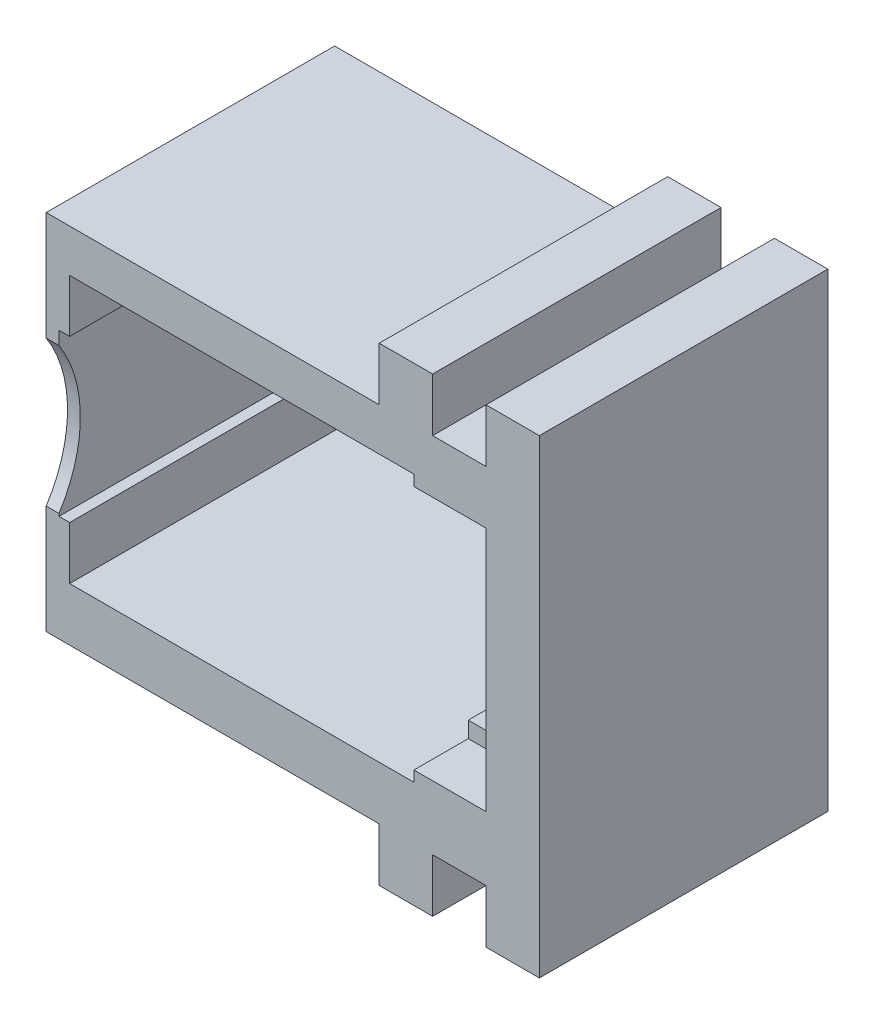
ISO-10303-21;
HEADER;
FILE_DESCRIPTION(('STEP AP214'),'2;1');
FILE_NAME('part.step','',(''),(''),'','','');
FILE_SCHEMA(('AUTOMOTIVE_DESIGN { 1 0 10303 214 1 1 1 1 }'));
ENDSEC;
DATA;
#1=APPLICATION_CONTEXT('core data for automotive mechanical design processes');
#2=APPLICATION_PROTOCOL_DEFINITION('international standard','automotive_design',2000,#1);
#3=PRODUCT_CONTEXT('',#1,'mechanical');
#4=PRODUCT('Part','Part','',(#3));
#5=PRODUCT_RELATED_PRODUCT_CATEGORY('part','',(#4));
#6=PRODUCT_DEFINITION_FORMATION('','',#4);
#7=PRODUCT_DEFINITION_CONTEXT('part definition',#1,'design');
#8=PRODUCT_DEFINITION('design','',#6,#7);
#9=PRODUCT_DEFINITION_SHAPE('','',#8);
#10=(LENGTH_UNIT() NAMED_UNIT(*) SI_UNIT(.MILLI.,.METRE.));
#11=(NAMED_UNIT(*) PLANE_ANGLE_UNIT() SI_UNIT($,.RADIAN.));
#12=(NAMED_UNIT(*) SI_UNIT($,.STERADIAN.) SOLID_ANGLE_UNIT());
#13=UNCERTAINTY_MEASURE_WITH_UNIT(LENGTH_MEASURE(1.E-05),#10,'distance_accuracy_value','');
#14=(GEOMETRIC_REPRESENTATION_CONTEXT(3) GLOBAL_UNCERTAINTY_ASSIGNED_CONTEXT((#13)) GLOBAL_UNIT_ASSIGNED_CONTEXT((#10,
#11,#12)) REPRESENTATION_CONTEXT('',''));
#15=CARTESIAN_POINT('',(0.,0.,0.));
#16=DIRECTION('',(0.,0.,1.));
#17=DIRECTION('',(1.,0.,0.));
#18=AXIS2_PLACEMENT_3D('',#15,#16,#17);
#19=CARTESIAN_POINT('',(0.,-32.0968292937225,0.));
#20=DIRECTION('',(0.,1.,0.));
#21=DIRECTION('',(0.,0.,1.));
#22=AXIS2_PLACEMENT_3D('',#19,#20,#21);
#23=PLANE('',#22);
#24=DIRECTION('',(0.,0.,-1.));
#25=VECTOR('',#24,1.);
#26=CARTESIAN_POINT('',(-28.3548906207739,-32.0968292937225,20.));
#27=LINE('',#26,#25);
#28=CARTESIAN_POINT('',(-28.3548906207739,-32.0968292937225,27.02));
#29=VERTEX_POINT('',#28);
#30=CARTESIAN_POINT('',(-28.3548906207739,-32.0968292937225,0.));
#31=VERTEX_POINT('',#30);
#32=EDGE_CURVE('E330',#29,#31,#27,.T.);
#33=ORIENTED_EDGE('',*,*,#32,.T.);
#34=DIRECTION('',(1.,0.,0.));
#35=VECTOR('',#34,1.);
#36=CARTESIAN_POINT('',(9.84510937922611,-32.0968292937225,0.));
#37=LINE('',#36,#35);
#38=CARTESIAN_POINT('',(2.84510937922611,-32.0968292937225,0.));
#39=VERTEX_POINT('',#38);
#40=EDGE_CURVE('E290',#31,#39,#37,.T.);
#41=ORIENTED_EDGE('',*,*,#40,.T.);
#42=DIRECTION('',(0.,0.,-1.));
#43=VECTOR('',#42,1.);
#44=CARTESIAN_POINT('',(2.84510937922611,-32.0968292937225,0.));
#45=LINE('',#44,#43);
#46=CARTESIAN_POINT('',(2.84510937922611,-32.0968292937225,27.02));
#47=VERTEX_POINT('',#46);
#48=EDGE_CURVE('E62',#47,#39,#45,.T.);
#49=ORIENTED_EDGE('',*,*,#48,.F.);
#50=DIRECTION('',(-1.,0.,0.));
#51=VECTOR('',#50,1.);
#52=CARTESIAN_POINT('',(-28.3548906207739,-32.0968292937225,27.02));
#53=LINE('',#52,#51);
#54=EDGE_CURVE('E327',#47,#29,#53,.T.);
#55=ORIENTED_EDGE('',*,*,#54,.T.);
#56=EDGE_LOOP('',(#33,#41,#49,#55));
#57=FACE_BOUND('',#56,.T.);
#58=ADVANCED_FACE('F45',(#57),#23,.F.);
#59=CARTESIAN_POINT('',(0.,1.90317070627753,0.));
#60=DIRECTION('',(0.,1.,0.));
#61=DIRECTION('',(0.,0.,1.));
#62=AXIS2_PLACEMENT_3D('',#59,#60,#61);
#63=PLANE('',#62);
#64=DIRECTION('',(-1.,0.,0.));
#65=VECTOR('',#64,1.);
#66=CARTESIAN_POINT('',(12.8451093792261,1.90317070627753,0.));
#67=LINE('',#66,#65);
#68=CARTESIAN_POINT('',(12.8451093792261,1.90317070627753,0.));
#69=VERTEX_POINT('',#68);
#70=CARTESIAN_POINT('',(7.8451093792261,1.90317070627753,0.));
#71=VERTEX_POINT('',#70);
#72=EDGE_CURVE('E281',#69,#71,#67,.T.);
#73=ORIENTED_EDGE('',*,*,#72,.T.);
#74=DIRECTION('',(0.,0.,1.));
#75=VECTOR('',#74,1.);
#76=CARTESIAN_POINT('',(7.8451093792261,1.90317070627753,0.));
#77=LINE('',#76,#75);
#78=CARTESIAN_POINT('',(7.84510937922608,1.90317070627753,27.02));
#79=VERTEX_POINT('',#78);
#80=EDGE_CURVE('E596',#71,#79,#77,.T.);
#81=ORIENTED_EDGE('',*,*,#80,.T.);
#82=DIRECTION('',(1.,0.,0.));
#83=VECTOR('',#82,1.);
#84=CARTESIAN_POINT('',(-28.3548906207739,1.90317070627753,27.02));
#85=LINE('',#84,#83);
#86=CARTESIAN_POINT('',(12.8451093792261,1.90317070627753,27.02));
#87=VERTEX_POINT('',#86);
#88=EDGE_CURVE('E280',#79,#87,#85,.T.);
#89=ORIENTED_EDGE('',*,*,#88,.T.);
#90=DIRECTION('',(0.,0.,-1.));
#91=VECTOR('',#90,1.);
#92=CARTESIAN_POINT('',(12.8451093792261,1.90317070627753,27.02));
#93=LINE('',#92,#91);
#94=EDGE_CURVE('E309',#87,#69,#93,.T.);
#95=ORIENTED_EDGE('',*,*,#94,.T.);
#96=EDGE_LOOP('',(#73,#81,#89,#95));
#97=FACE_BOUND('',#96,.T.);
#98=ADVANCED_FACE('F593',(#97),#63,.T.);
#99=CARTESIAN_POINT('',(-28.3548906207739,-0.0968292937224696,2.));
#100=DIRECTION('',(1.,0.,0.));
#101=DIRECTION('',(0.,0.,-1.));
#102=AXIS2_PLACEMENT_3D('',#99,#100,#101);
#103=PLANE('',#102);
#104=DIRECTION('',(0.,0.,1.));
#105=VECTOR('',#104,1.);
#106=CARTESIAN_POINT('',(-28.3548906207739,1.90317070627753,20.));
#107=LINE('',#106,#105);
#108=CARTESIAN_POINT('',(-28.3548906207739,1.90317070627753,0.));
#109=VERTEX_POINT('',#108);
#110=CARTESIAN_POINT('',(-28.3548906207739,1.90317070627753,27.02));
#111=VERTEX_POINT('',#110);
#112=EDGE_CURVE('E269',#109,#111,#107,.T.);
#113=ORIENTED_EDGE('',*,*,#112,.F.);
#114=DIRECTION('',(0.,-1.,0.));
#115=VECTOR('',#114,1.);
#116=CARTESIAN_POINT('',(-28.3548906207739,1.90317070627753,0.));
#117=LINE('',#116,#115);
#118=EDGE_CURVE('E272',#109,#31,#117,.T.);
#119=ORIENTED_EDGE('',*,*,#118,.T.);
#120=ORIENTED_EDGE('',*,*,#32,.F.);
#121=DIRECTION('',(0.,1.,0.));
#122=VECTOR('',#121,1.);
#123=CARTESIAN_POINT('',(-28.3548906207739,-0.0968292937224667,27.02));
#124=LINE('',#123,#122);
#125=CARTESIAN_POINT('',(-28.3548906207739,-21.908583840093,27.02));
#126=VERTEX_POINT('',#125);
#127=EDGE_CURVE('E390',#29,#126,#124,.T.);
#128=ORIENTED_EDGE('',*,*,#127,.T.);
#129=CARTESIAN_POINT('',(-28.3548906207739,-15.0968292937225,37.62));
#130=DIRECTION('',(-1.,0.,0.));
#131=DIRECTION('',(0.,0.,1.));
#132=AXIS2_PLACEMENT_3D('',#129,#130,#131);
#133=CIRCLE('',#132,12.6);
#134=CARTESIAN_POINT('',(-28.3548906207739,-8.2850747473519,27.02));
#135=VERTEX_POINT('',#134);
#136=EDGE_CURVE('E394',#135,#126,#133,.T.);
#137=ORIENTED_EDGE('',*,*,#136,.F.);
#138=DIRECTION('',(0.,1.,0.));
#139=VECTOR('',#138,1.);
#140=CARTESIAN_POINT('',(-28.3548906207739,-0.0968292937224667,27.02));
#141=LINE('',#140,#139);
#142=EDGE_CURVE('E275',#135,#111,#141,.T.);
#143=ORIENTED_EDGE('',*,*,#142,.T.);
#144=EDGE_LOOP('',(#113,#119,#120,#128,#137,#143));
#145=FACE_BOUND('',#144,.T.);
#146=ADVANCED_FACE('F47',(#145),#103,.F.);
#147=CARTESIAN_POINT('',(0.,0.,2.));
#148=DIRECTION('',(0.,0.,1.));
#149=DIRECTION('',(1.,0.,0.));
#150=AXIS2_PLACEMENT_3D('',#147,#148,#149);
#151=PLANE('',#150);
#152=DIRECTION('',(0.,-1.,0.));
#153=VECTOR('',#152,1.);
#154=CARTESIAN_POINT('',(-26.1548906207739,0.,2.));
#155=LINE('',#154,#153);
#156=CARTESIAN_POINT('',(-26.1548906207739,-22.1468292937225,2.));
#157=VERTEX_POINT('',#156);
#158=CARTESIAN_POINT('',(-26.1548906207739,-27.0968292937225,2.));
#159=VERTEX_POINT('',#158);
#160=EDGE_CURVE('E452',#157,#159,#155,.T.);
#161=ORIENTED_EDGE('',*,*,#160,.T.);
#162=DIRECTION('',(-1.,0.,0.));
#163=VECTOR('',#162,1.);
#164=CARTESIAN_POINT('',(-26.1548906207739,-27.0968292937225,2.));
#165=LINE('',#164,#163);
#166=CARTESIAN_POINT('',(6.09510937922611,-27.0968292937225,2.));
#167=VERTEX_POINT('',#166);
#168=EDGE_CURVE('E333',#167,#159,#165,.T.);
#169=ORIENTED_EDGE('',*,*,#168,.F.);
#170=DIRECTION('',(0.,1.,0.));
#171=VECTOR('',#170,1.);
#172=CARTESIAN_POINT('',(6.09510937922611,0.,2.));
#173=LINE('',#172,#171);
#174=CARTESIAN_POINT('',(6.09510937922611,-24.5968292937224,2.));
#175=VERTEX_POINT('',#174);
#176=EDGE_CURVE('E453',#167,#175,#173,.T.);
#177=ORIENTED_EDGE('',*,*,#176,.T.);
#178=DIRECTION('',(-1.,0.,0.));
#179=VECTOR('',#178,1.);
#180=CARTESIAN_POINT('',(0.,-24.5968292937224,2.));
#181=LINE('',#180,#179);
#182=CARTESIAN_POINT('',(7.84510937922611,-24.5968292937224,2.));
#183=VERTEX_POINT('',#182);
#184=EDGE_CURVE('E456',#183,#175,#181,.T.);
#185=ORIENTED_EDGE('',*,*,#184,.F.);
#186=DIRECTION('',(0.,1.,0.));
#187=VECTOR('',#186,1.);
#188=CARTESIAN_POINT('',(7.84510937922611,0.,2.));
#189=LINE('',#188,#187);
#190=CARTESIAN_POINT('',(7.84510937922611,-4.59682929372242,2.));
#191=VERTEX_POINT('',#190);
#192=EDGE_CURVE('E460',#183,#191,#189,.T.);
#193=ORIENTED_EDGE('',*,*,#192,.T.);
#194=DIRECTION('',(-1.,0.,0.));
#195=VECTOR('',#194,1.);
#196=CARTESIAN_POINT('',(0.,-4.59682929372242,2.));
#197=LINE('',#196,#195);
#198=CARTESIAN_POINT('',(6.09510937922611,-4.59682929372242,2.));
#199=VERTEX_POINT('',#198);
#200=EDGE_CURVE('E464',#191,#199,#197,.T.);
#201=ORIENTED_EDGE('',*,*,#200,.T.);
#202=DIRECTION('',(0.,1.,0.));
#203=VECTOR('',#202,1.);
#204=CARTESIAN_POINT('',(6.09510937922611,0.,2.));
#205=LINE('',#204,#203);
#206=CARTESIAN_POINT('',(6.09510937922611,-2.09682929372247,2.));
#207=VERTEX_POINT('',#206);
#208=EDGE_CURVE('E468',#199,#207,#205,.T.);
#209=ORIENTED_EDGE('',*,*,#208,.T.);
#210=DIRECTION('',(1.,0.,0.));
#211=VECTOR('',#210,1.);
#212=CARTESIAN_POINT('',(0.,-2.09682929372247,2.));
#213=LINE('',#212,#211);
#214=CARTESIAN_POINT('',(-26.1548906207739,-2.09682929372247,2.));
#215=VERTEX_POINT('',#214);
#216=EDGE_CURVE('E472',#215,#207,#213,.T.);
#217=ORIENTED_EDGE('',*,*,#216,.F.);
#218=CARTESIAN_POINT('',(-26.1548906207739,-7.04682929372247,2.));
#219=VERTEX_POINT('',#218);
#220=EDGE_CURVE('E476',#215,#219,#155,.T.);
#221=ORIENTED_EDGE('',*,*,#220,.T.);
#222=DIRECTION('',(-1.,0.,0.));
#223=VECTOR('',#222,1.);
#224=CARTESIAN_POINT('',(0.,-7.04682929372247,2.));
#225=LINE('',#224,#223);
#226=CARTESIAN_POINT('',(-27.1548906207739,-7.04682929372247,2.));
#227=VERTEX_POINT('',#226);
#228=EDGE_CURVE('E480',#219,#227,#225,.T.);
#229=ORIENTED_EDGE('',*,*,#228,.T.);
#230=DIRECTION('',(0.,1.,0.));
#231=VECTOR('',#230,1.);
#232=CARTESIAN_POINT('',(-27.1548906207739,0.,2.));
#233=LINE('',#232,#231);
#234=CARTESIAN_POINT('',(-27.1548906207739,-22.1468292937225,2.));
#235=VERTEX_POINT('',#234);
#236=EDGE_CURVE('E483',#235,#227,#233,.T.);
#237=ORIENTED_EDGE('',*,*,#236,.F.);
#238=DIRECTION('',(-1.,0.,0.));
#239=VECTOR('',#238,1.);
#240=CARTESIAN_POINT('',(0.,-22.1468292937225,2.));
#241=LINE('',#240,#239);
#242=EDGE_CURVE('E486',#157,#235,#241,.T.);
#243=ORIENTED_EDGE('',*,*,#242,.F.);
#244=EDGE_LOOP('',(#161,#169,#177,#185,#193,#201,#209,#217,#221,#229,#237,#243));
#245=FACE_BOUND('',#244,.T.);
#246=ADVANCED_FACE('F542',(#245),#151,.T.);
#247=CARTESIAN_POINT('',(6.09510937922611,0.,29.02));
#248=DIRECTION('',(-1.,0.,0.));
#249=DIRECTION('',(0.,0.,1.));
#250=AXIS2_PLACEMENT_3D('',#247,#248,#249);
#251=PLANE('',#250);
#252=ORIENTED_EDGE('',*,*,#176,.F.);
#253=DIRECTION('',(0.,0.,-1.));
#254=VECTOR('',#253,1.);
#255=CARTESIAN_POINT('',(6.09510937922611,-27.0968292937225,59.4092343225338));
#256=LINE('',#255,#254);
#257=CARTESIAN_POINT('',(6.09510937922611,-27.0968292937225,27.02));
#258=VERTEX_POINT('',#257);
#259=EDGE_CURVE('E340',#258,#167,#256,.T.);
#260=ORIENTED_EDGE('',*,*,#259,.F.);
#261=DIRECTION('',(0.,-1.,0.));
#262=VECTOR('',#261,1.);
#263=CARTESIAN_POINT('',(6.09510937922611,0.,27.02));
#264=LINE('',#263,#262);
#265=CARTESIAN_POINT('',(6.09510937922611,-26.0968292937225,27.02));
#266=VERTEX_POINT('',#265);
#267=EDGE_CURVE('E375',#266,#258,#264,.T.);
#268=ORIENTED_EDGE('',*,*,#267,.F.);
#269=DIRECTION('',(0.,0.,-1.));
#270=VECTOR('',#269,1.);
#271=CARTESIAN_POINT('',(6.09510937922611,-26.0968292937225,29.02));
#272=LINE('',#271,#270);
#273=CARTESIAN_POINT('',(6.09510937922611,-26.0968292937225,21.93));
#274=VERTEX_POINT('',#273);
#275=EDGE_CURVE('E496',#266,#274,#272,.T.);
#276=ORIENTED_EDGE('',*,*,#275,.T.);
#277=DIRECTION('',(0.,1.,0.));
#278=VECTOR('',#277,1.);
#279=CARTESIAN_POINT('',(6.0951093792261,-3.09682929372248,21.93));
#280=LINE('',#279,#278);
#281=CARTESIAN_POINT('',(6.09510937922611,-24.5968292937224,21.93));
#282=VERTEX_POINT('',#281);
#283=EDGE_CURVE('E501',#274,#282,#280,.T.);
#284=ORIENTED_EDGE('',*,*,#283,.T.);
#285=DIRECTION('',(0.,0.,-1.));
#286=VECTOR('',#285,1.);
#287=CARTESIAN_POINT('',(6.09510937922611,-24.5968292937224,29.02));
#288=LINE('',#287,#286);
#289=EDGE_CURVE('E445',#282,#175,#288,.T.);
#290=ORIENTED_EDGE('',*,*,#289,.T.);
#291=EDGE_LOOP('',(#252,#260,#268,#276,#284,#290));
#292=FACE_BOUND('',#291,.T.);
#293=ADVANCED_FACE('F552',(#292),#251,.T.);
#294=CARTESIAN_POINT('',(-26.1548906207739,0.,29.02));
#295=DIRECTION('',(1.,0.,0.));
#296=DIRECTION('',(0.,1.,0.));
#297=AXIS2_PLACEMENT_3D('',#294,#295,#296);
#298=PLANE('',#297);
#299=DIRECTION('',(0.,1.,0.));
#300=VECTOR('',#299,1.);
#301=CARTESIAN_POINT('',(-26.1548906207739,0.,27.02));
#302=LINE('',#301,#300);
#303=CARTESIAN_POINT('',(-26.1548906207739,-27.0968292937225,27.02));
#304=VERTEX_POINT('',#303);
#305=CARTESIAN_POINT('',(-26.1548906207739,-22.1468292937225,27.02));
#306=VERTEX_POINT('',#305);
#307=EDGE_CURVE('E379',#304,#306,#302,.T.);
#308=ORIENTED_EDGE('',*,*,#307,.F.);
#309=DIRECTION('',(0.,0.,-1.));
#310=VECTOR('',#309,1.);
#311=CARTESIAN_POINT('',(-26.1548906207739,-27.0968292937225,59.4092343225338));
#312=LINE('',#311,#310);
#313=EDGE_CURVE('E336',#304,#159,#312,.T.);
#314=ORIENTED_EDGE('',*,*,#313,.T.);
#315=ORIENTED_EDGE('',*,*,#160,.F.);
#316=DIRECTION('',(0.,0.,-1.));
#317=VECTOR('',#316,1.);
#318=CARTESIAN_POINT('',(-26.1548906207739,-22.1468292937225,29.02));
#319=LINE('',#318,#317);
#320=EDGE_CURVE('E449',#306,#157,#319,.T.);
#321=ORIENTED_EDGE('',*,*,#320,.F.);
#322=EDGE_LOOP('',(#308,#314,#315,#321));
#323=FACE_BOUND('',#322,.T.);
#324=ADVANCED_FACE('F750',(#323),#298,.T.);
#325=CARTESIAN_POINT('',(0.,0.,0.));
#326=DIRECTION('',(0.,0.,1.));
#327=DIRECTION('',(1.,0.,0.));
#328=AXIS2_PLACEMENT_3D('',#325,#326,#327);
#329=PLANE('',#328);
#330=ORIENTED_EDGE('',*,*,#40,.F.);
#331=ORIENTED_EDGE('',*,*,#118,.F.);
#332=CARTESIAN_POINT('',(2.8451093792261,1.90317070627753,0.));
#333=VERTEX_POINT('',#332);
#334=EDGE_CURVE('E287',#333,#109,#67,.T.);
#335=ORIENTED_EDGE('',*,*,#334,.F.);
#336=DIRECTION('',(0.,-1.,0.));
#337=VECTOR('',#336,1.);
#338=CARTESIAN_POINT('',(2.8451093792261,6.90317070627753,0.));
#339=LINE('',#338,#337);
#340=CARTESIAN_POINT('',(2.8451093792261,6.90317070627753,0.));
#341=VERTEX_POINT('',#340);
#342=EDGE_CURVE('E298',#341,#333,#339,.T.);
#343=ORIENTED_EDGE('',*,*,#342,.F.);
#344=DIRECTION('',(-1.,0.,0.));
#345=VECTOR('',#344,1.);
#346=CARTESIAN_POINT('',(0.,6.90317070627753,0.));
#347=LINE('',#346,#345);
#348=CARTESIAN_POINT('',(7.8451093792261,6.90317070627753,0.));
#349=VERTEX_POINT('',#348);
#350=EDGE_CURVE('E677',#349,#341,#347,.T.);
#351=ORIENTED_EDGE('',*,*,#350,.F.);
#352=DIRECTION('',(0.,-1.,0.));
#353=VECTOR('',#352,1.);
#354=CARTESIAN_POINT('',(7.8451093792261,6.90317070627753,0.));
#355=LINE('',#354,#353);
#356=EDGE_CURVE('E691',#349,#71,#355,.T.);
#357=ORIENTED_EDGE('',*,*,#356,.T.);
#358=ORIENTED_EDGE('',*,*,#72,.F.);
#359=DIRECTION('',(0.,1.,0.));
#360=VECTOR('',#359,1.);
#361=CARTESIAN_POINT('',(12.8451093792261,-37.0968292937225,0.));
#362=LINE('',#361,#360);
#363=CARTESIAN_POINT('',(12.8451093792261,6.90317070627753,0.));
#364=VERTEX_POINT('',#363);
#365=EDGE_CURVE('E606',#69,#364,#362,.T.);
#366=ORIENTED_EDGE('',*,*,#365,.T.);
#367=DIRECTION('',(-1.,0.,0.));
#368=VECTOR('',#367,1.);
#369=CARTESIAN_POINT('',(12.8451093792261,6.90317070627753,0.));
#370=LINE('',#369,#368);
#371=CARTESIAN_POINT('',(17.8451093792261,6.90317070627753,0.));
#372=VERTEX_POINT('',#371);
#373=EDGE_CURVE('E654',#372,#364,#370,.T.);
#374=ORIENTED_EDGE('',*,*,#373,.F.);
#375=DIRECTION('',(0.,1.,0.));
#376=VECTOR('',#375,1.);
#377=CARTESIAN_POINT('',(17.8451093792261,-37.0968292937225,0.));
#378=LINE('',#377,#376);
#379=CARTESIAN_POINT('',(17.8451093792261,-37.0968292937225,0.));
#380=VERTEX_POINT('',#379);
#381=EDGE_CURVE('E661',#380,#372,#378,.T.);
#382=ORIENTED_EDGE('',*,*,#381,.F.);
#383=DIRECTION('',(-1.,0.,0.));
#384=VECTOR('',#383,1.);
#385=CARTESIAN_POINT('',(12.8451093792261,-37.0968292937225,0.));
#386=LINE('',#385,#384);
#387=CARTESIAN_POINT('',(12.8451093792261,-37.0968292937225,0.));
#388=VERTEX_POINT('',#387);
#389=EDGE_CURVE('E657',#380,#388,#386,.T.);
#390=ORIENTED_EDGE('',*,*,#389,.T.);
#391=CARTESIAN_POINT('',(12.8451093792261,-32.0968292937225,0.));
#392=VERTEX_POINT('',#391);
#393=EDGE_CURVE('E670',#388,#392,#362,.T.);
#394=ORIENTED_EDGE('',*,*,#393,.T.);
#395=CARTESIAN_POINT('',(7.84510937922611,-32.0968292937225,0.));
#396=VERTEX_POINT('',#395);
#397=EDGE_CURVE('E324',#396,#392,#37,.T.);
#398=ORIENTED_EDGE('',*,*,#397,.F.);
#399=DIRECTION('',(0.,1.,0.));
#400=VECTOR('',#399,1.);
#401=CARTESIAN_POINT('',(7.84510937922611,-37.0968292937225,0.));
#402=LINE('',#401,#400);
#403=CARTESIAN_POINT('',(7.84510937922611,-37.0968292937225,0.));
#404=VERTEX_POINT('',#403);
#405=EDGE_CURVE('E636',#404,#396,#402,.T.);
#406=ORIENTED_EDGE('',*,*,#405,.F.);
#407=DIRECTION('',(1.,0.,0.));
#408=VECTOR('',#407,1.);
#409=CARTESIAN_POINT('',(0.,-37.0968292937225,0.));
#410=LINE('',#409,#408);
#411=CARTESIAN_POINT('',(2.84510937922611,-37.0968292937225,0.));
#412=VERTEX_POINT('',#411);
#413=EDGE_CURVE('E633',#412,#404,#410,.T.);
#414=ORIENTED_EDGE('',*,*,#413,.F.);
#415=DIRECTION('',(0.,1.,0.));
#416=VECTOR('',#415,1.);
#417=CARTESIAN_POINT('',(2.84510937922611,-37.0968292937225,0.));
#418=LINE('',#417,#416);
#419=EDGE_CURVE('E639',#412,#39,#418,.T.);
#420=ORIENTED_EDGE('',*,*,#419,.T.);
#421=EDGE_LOOP('',(#330,#331,#335,#343,#351,#357,#358,#366,#374,#382,#390,#394,#398,#406,#414,#420));
#422=FACE_BOUND('',#421,.T.);
#423=ADVANCED_FACE('F285',(#422),#329,.F.);
#424=CARTESIAN_POINT('',(0.,-22.1468292937225,29.02));
#425=DIRECTION('',(0.,-1.,0.));
#426=DIRECTION('',(0.,0.,-1.));
#427=AXIS2_PLACEMENT_3D('',#424,#425,#426);
#428=PLANE('',#427);
#429=DIRECTION('',(0.,0.,-1.));
#430=VECTOR('',#429,1.);
#431=CARTESIAN_POINT('',(-27.1548906207739,-22.1468292937225,29.02));
#432=LINE('',#431,#430);
#433=CARTESIAN_POINT('',(-27.1548906207739,-22.1468292937225,27.02));
#434=VERTEX_POINT('',#433);
#435=EDGE_CURVE('E406',#434,#235,#432,.T.);
#436=ORIENTED_EDGE('',*,*,#435,.F.);
#437=DIRECTION('',(1.,0.,0.));
#438=VECTOR('',#437,1.);
#439=CARTESIAN_POINT('',(0.,-22.1468292937225,27.02));
#440=LINE('',#439,#438);
#441=EDGE_CURVE('E382',#434,#306,#440,.T.);
#442=ORIENTED_EDGE('',*,*,#441,.T.);
#443=ORIENTED_EDGE('',*,*,#320,.T.);
#444=ORIENTED_EDGE('',*,*,#242,.T.);
#445=EDGE_LOOP('',(#436,#442,#443,#444));
#446=FACE_BOUND('',#445,.T.);
#447=ADVANCED_FACE('F770',(#446),#428,.F.);
#448=CARTESIAN_POINT('',(-27.1548906207739,0.,29.02));
#449=DIRECTION('',(-1.,0.,0.));
#450=DIRECTION('',(0.,0.,1.));
#451=AXIS2_PLACEMENT_3D('',#448,#449,#450);
#452=PLANE('',#451);
#453=CARTESIAN_POINT('',(-27.1548906207739,-15.0968292937225,37.62));
#454=DIRECTION('',(-1.,0.,0.));
#455=DIRECTION('',(0.,0.,1.));
#456=AXIS2_PLACEMENT_3D('',#453,#454,#455);
#457=CIRCLE('',#456,12.6);
#458=CARTESIAN_POINT('',(-27.1548906207739,-21.908583840093,27.02));
#459=VERTEX_POINT('',#458);
#460=CARTESIAN_POINT('',(-27.1548906207739,-8.2850747473519,27.02));
#461=VERTEX_POINT('',#460);
#462=EDGE_CURVE('E399',#459,#461,#457,.F.);
#463=ORIENTED_EDGE('',*,*,#462,.F.);
#464=DIRECTION('',(0.,-1.,0.));
#465=VECTOR('',#464,1.);
#466=CARTESIAN_POINT('',(-27.1548906207739,0.,27.02));
#467=LINE('',#466,#465);
#468=EDGE_CURVE('E386',#459,#434,#467,.T.);
#469=ORIENTED_EDGE('',*,*,#468,.T.);
#470=ORIENTED_EDGE('',*,*,#435,.T.);
#471=ORIENTED_EDGE('',*,*,#236,.T.);
#472=DIRECTION('',(0.,0.,-1.));
#473=VECTOR('',#472,1.);
#474=CARTESIAN_POINT('',(-27.1548906207739,-7.04682929372247,29.02));
#475=LINE('',#474,#473);
#476=CARTESIAN_POINT('',(-27.1548906207739,-7.04682929372247,27.02));
#477=VERTEX_POINT('',#476);
#478=EDGE_CURVE('E415',#477,#227,#475,.T.);
#479=ORIENTED_EDGE('',*,*,#478,.F.);
#480=DIRECTION('',(0.,-1.,0.));
#481=VECTOR('',#480,1.);
#482=CARTESIAN_POINT('',(-27.1548906207739,0.,27.02));
#483=LINE('',#482,#481);
#484=EDGE_CURVE('E363',#477,#461,#483,.T.);
#485=ORIENTED_EDGE('',*,*,#484,.T.);
#486=EDGE_LOOP('',(#463,#469,#470,#471,#479,#485));
#487=FACE_BOUND('',#486,.T.);
#488=ADVANCED_FACE('F583',(#487),#452,.F.);
#489=CARTESIAN_POINT('',(0.,-7.04682929372247,29.02));
#490=DIRECTION('',(0.,-1.,0.));
#491=DIRECTION('',(0.,0.,-1.));
#492=AXIS2_PLACEMENT_3D('',#489,#490,#491);
#493=PLANE('',#492);
#494=DIRECTION('',(1.,0.,0.));
#495=VECTOR('',#494,1.);
#496=CARTESIAN_POINT('',(0.,-7.04682929372247,27.02));
#497=LINE('',#496,#495);
#498=CARTESIAN_POINT('',(-26.1548906207739,-7.04682929372247,27.02));
#499=VERTEX_POINT('',#498);
#500=EDGE_CURVE('E360',#477,#499,#497,.T.);
#501=ORIENTED_EDGE('',*,*,#500,.F.);
#502=ORIENTED_EDGE('',*,*,#478,.T.);
#503=ORIENTED_EDGE('',*,*,#228,.F.);
#504=DIRECTION('',(0.,0.,-1.));
#505=VECTOR('',#504,1.);
#506=CARTESIAN_POINT('',(-26.1548906207739,-7.04682929372247,29.02));
#507=LINE('',#506,#505);
#508=EDGE_CURVE('E421',#499,#219,#507,.T.);
#509=ORIENTED_EDGE('',*,*,#508,.F.);
#510=EDGE_LOOP('',(#501,#502,#503,#509));
#511=FACE_BOUND('',#510,.T.);
#512=ADVANCED_FACE('F580',(#511),#493,.T.);
#513=DIRECTION('',(0.,1.,0.));
#514=VECTOR('',#513,1.);
#515=CARTESIAN_POINT('',(-26.1548906207739,0.,27.02));
#516=LINE('',#515,#514);
#517=CARTESIAN_POINT('',(-26.1548906207739,-2.09682929372247,27.02));
#518=VERTEX_POINT('',#517);
#519=EDGE_CURVE('E357',#499,#518,#516,.T.);
#520=ORIENTED_EDGE('',*,*,#519,.F.);
#521=ORIENTED_EDGE('',*,*,#508,.T.);
#522=ORIENTED_EDGE('',*,*,#220,.F.);
#523=DIRECTION('',(0.,0.,-1.));
#524=VECTOR('',#523,1.);
#525=CARTESIAN_POINT('',(-26.1548906207739,-2.09682929372247,29.02));
#526=LINE('',#525,#524);
#527=EDGE_CURVE('E428',#518,#215,#526,.T.);
#528=ORIENTED_EDGE('',*,*,#527,.F.);
#529=EDGE_LOOP('',(#520,#521,#522,#528));
#530=FACE_BOUND('',#529,.T.);
#531=ADVANCED_FACE('F578',(#530),#298,.T.);
#532=CARTESIAN_POINT('',(0.,-2.09682929372247,29.02));
#533=DIRECTION('',(0.,1.,0.));
#534=DIRECTION('',(-1.,0.,0.));
#535=AXIS2_PLACEMENT_3D('',#532,#533,#534);
#536=PLANE('',#535);
#537=DIRECTION('',(0.,0.,-1.));
#538=VECTOR('',#537,1.);
#539=CARTESIAN_POINT('',(6.09510937922611,-2.09682929372247,29.02));
#540=LINE('',#539,#538);
#541=CARTESIAN_POINT('',(6.09510937922611,-2.09682929372247,27.02));
#542=VERTEX_POINT('',#541);
#543=EDGE_CURVE('E433',#542,#207,#540,.T.);
#544=ORIENTED_EDGE('',*,*,#543,.F.);
#545=DIRECTION('',(-1.,0.,0.));
#546=VECTOR('',#545,1.);
#547=CARTESIAN_POINT('',(0.,-2.09682929372247,27.02));
#548=LINE('',#547,#546);
#549=EDGE_CURVE('E353',#542,#518,#548,.T.);
#550=ORIENTED_EDGE('',*,*,#549,.T.);
#551=ORIENTED_EDGE('',*,*,#527,.T.);
#552=ORIENTED_EDGE('',*,*,#216,.T.);
#553=EDGE_LOOP('',(#544,#550,#551,#552));
#554=FACE_BOUND('',#553,.T.);
#555=ADVANCED_FACE('F572',(#554),#536,.F.);
#556=CARTESIAN_POINT('',(6.09510937922611,0.,29.02));
#557=DIRECTION('',(-1.,0.,0.));
#558=DIRECTION('',(0.,0.,1.));
#559=AXIS2_PLACEMENT_3D('',#556,#557,#558);
#560=PLANE('',#559);
#561=DIRECTION('',(0.,-1.,0.));
#562=VECTOR('',#561,1.);
#563=CARTESIAN_POINT('',(6.09510937922611,0.,27.02));
#564=LINE('',#563,#562);
#565=CARTESIAN_POINT('',(6.0951093792261,-3.09682929372247,27.02));
#566=VERTEX_POINT('',#565);
#567=EDGE_CURVE('E350',#542,#566,#564,.T.);
#568=ORIENTED_EDGE('',*,*,#567,.F.);
#569=ORIENTED_EDGE('',*,*,#543,.T.);
#570=ORIENTED_EDGE('',*,*,#208,.F.);
#571=DIRECTION('',(0.,0.,-1.));
#572=VECTOR('',#571,1.);
#573=CARTESIAN_POINT('',(6.09510937922611,-4.59682929372242,29.02));
#574=LINE('',#573,#572);
#575=CARTESIAN_POINT('',(6.09510937922611,-4.59682929372242,21.93));
#576=VERTEX_POINT('',#575);
#577=EDGE_CURVE('E436',#576,#199,#574,.T.);
#578=ORIENTED_EDGE('',*,*,#577,.F.);
#579=DIRECTION('',(0.,1.,0.));
#580=VECTOR('',#579,1.);
#581=CARTESIAN_POINT('',(6.0951093792261,-3.09682929372248,21.93));
#582=LINE('',#581,#580);
#583=CARTESIAN_POINT('',(6.0951093792261,-3.09682929372247,21.93));
#584=VERTEX_POINT('',#583);
#585=EDGE_CURVE('E502',#576,#584,#582,.T.);
#586=ORIENTED_EDGE('',*,*,#585,.T.);
#587=DIRECTION('',(0.,0.,1.));
#588=VECTOR('',#587,1.);
#589=CARTESIAN_POINT('',(6.0951093792261,-3.09682929372247,29.02));
#590=LINE('',#589,#588);
#591=EDGE_CURVE('E495',#584,#566,#590,.T.);
#592=ORIENTED_EDGE('',*,*,#591,.T.);
#593=EDGE_LOOP('',(#568,#569,#570,#578,#586,#592));
#594=FACE_BOUND('',#593,.T.);
#595=ADVANCED_FACE('F525',(#594),#560,.T.);
#596=CARTESIAN_POINT('',(0.,-4.59682929372242,29.02));
#597=DIRECTION('',(0.,-1.,0.));
#598=DIRECTION('',(1.,0.,0.));
#599=AXIS2_PLACEMENT_3D('',#596,#597,#598);
#600=PLANE('',#599);
#601=DIRECTION('',(-1.,0.,0.));
#602=VECTOR('',#601,1.);
#603=CARTESIAN_POINT('',(-28.3558906207739,-4.59682929372243,21.93));
#604=LINE('',#603,#602);
#605=CARTESIAN_POINT('',(7.84510937922611,-4.59682929372242,21.93));
#606=VERTEX_POINT('',#605);
#607=EDGE_CURVE('E517',#606,#576,#604,.T.);
#608=ORIENTED_EDGE('',*,*,#607,.T.);
#609=ORIENTED_EDGE('',*,*,#577,.T.);
#610=ORIENTED_EDGE('',*,*,#200,.F.);
#611=DIRECTION('',(0.,0.,-1.));
#612=VECTOR('',#611,1.);
#613=CARTESIAN_POINT('',(7.84510937922611,-4.59682929372242,29.02));
#614=LINE('',#613,#612);
#615=EDGE_CURVE('E439',#606,#191,#614,.T.);
#616=ORIENTED_EDGE('',*,*,#615,.F.);
#617=EDGE_LOOP('',(#608,#609,#610,#616));
#618=FACE_BOUND('',#617,.T.);
#619=ADVANCED_FACE('F533',(#618),#600,.T.);
#620=CARTESIAN_POINT('',(7.84510937922611,0.,29.02));
#621=DIRECTION('',(-1.,0.,0.));
#622=DIRECTION('',(0.,0.,1.));
#623=AXIS2_PLACEMENT_3D('',#620,#621,#622);
#624=PLANE('',#623);
#625=DIRECTION('',(0.,1.,0.));
#626=VECTOR('',#625,1.);
#627=CARTESIAN_POINT('',(7.8451093792261,-3.09682929372248,21.93));
#628=LINE('',#627,#626);
#629=CARTESIAN_POINT('',(7.84510937922611,-24.5968292937224,21.93));
#630=VERTEX_POINT('',#629);
#631=EDGE_CURVE('E506',#630,#606,#628,.T.);
#632=ORIENTED_EDGE('',*,*,#631,.T.);
#633=ORIENTED_EDGE('',*,*,#615,.T.);
#634=ORIENTED_EDGE('',*,*,#192,.F.);
#635=DIRECTION('',(0.,0.,-1.));
#636=VECTOR('',#635,1.);
#637=CARTESIAN_POINT('',(7.84510937922611,-24.5968292937224,29.02));
#638=LINE('',#637,#636);
#639=EDGE_CURVE('E442',#630,#183,#638,.T.);
#640=ORIENTED_EDGE('',*,*,#639,.F.);
#641=EDGE_LOOP('',(#632,#633,#634,#640));
#642=FACE_BOUND('',#641,.T.);
#643=ADVANCED_FACE('F537',(#642),#624,.T.);
#644=CARTESIAN_POINT('',(0.,-24.5968292937224,29.02));
#645=DIRECTION('',(0.,-1.,0.));
#646=DIRECTION('',(0.,0.,-1.));
#647=AXIS2_PLACEMENT_3D('',#644,#645,#646);
#648=PLANE('',#647);
#649=ORIENTED_EDGE('',*,*,#289,.F.);
#650=DIRECTION('',(-1.,0.,0.));
#651=VECTOR('',#650,1.);
#652=CARTESIAN_POINT('',(-28.3558906207739,-24.5968292937224,21.93));
#653=LINE('',#652,#651);
#654=EDGE_CURVE('E490',#630,#282,#653,.T.);
#655=ORIENTED_EDGE('',*,*,#654,.F.);
#656=ORIENTED_EDGE('',*,*,#639,.T.);
#657=ORIENTED_EDGE('',*,*,#184,.T.);
#658=EDGE_LOOP('',(#649,#655,#656,#657));
#659=FACE_BOUND('',#658,.T.);
#660=ADVANCED_FACE('F547',(#659),#648,.F.);
#661=CARTESIAN_POINT('',(-28.3558906207739,-3.09682929372248,21.93));
#662=DIRECTION('',(0.,0.,-1.));
#663=DIRECTION('',(0.,1.,0.));
#664=AXIS2_PLACEMENT_3D('',#661,#662,#663);
#665=PLANE('',#664);
#666=ORIENTED_EDGE('',*,*,#607,.F.);
#667=ORIENTED_EDGE('',*,*,#631,.F.);
#668=ORIENTED_EDGE('',*,*,#654,.T.);
#669=ORIENTED_EDGE('',*,*,#283,.F.);
#670=DIRECTION('',(1.,0.,0.));
#671=VECTOR('',#670,1.);
#672=CARTESIAN_POINT('',(-28.3558906207739,-26.0968292937225,21.93));
#673=LINE('',#672,#671);
#674=CARTESIAN_POINT('',(12.8451093792261,-26.0968292937225,21.93));
#675=VERTEX_POINT('',#674);
#676=EDGE_CURVE('E491',#274,#675,#673,.T.);
#677=ORIENTED_EDGE('',*,*,#676,.T.);
#678=DIRECTION('',(0.,-1.,0.));
#679=VECTOR('',#678,1.);
#680=CARTESIAN_POINT('',(12.8451093792261,0.,21.93));
#681=LINE('',#680,#679);
#682=CARTESIAN_POINT('',(12.8451093792261,-3.09682929372247,21.93));
#683=VERTEX_POINT('',#682);
#684=EDGE_CURVE('E312',#683,#675,#681,.T.);
#685=ORIENTED_EDGE('',*,*,#684,.F.);
#686=DIRECTION('',(1.,0.,0.));
#687=VECTOR('',#686,1.);
#688=CARTESIAN_POINT('',(-28.3558906207739,-3.09682929372248,21.93));
#689=LINE('',#688,#687);
#690=EDGE_CURVE('E497',#584,#683,#689,.T.);
#691=ORIENTED_EDGE('',*,*,#690,.F.);
#692=ORIENTED_EDGE('',*,*,#585,.F.);
#693=EDGE_LOOP('',(#666,#667,#668,#669,#677,#685,#691,#692));
#694=FACE_BOUND('',#693,.T.);
#695=ADVANCED_FACE('F529',(#694),#665,.F.);
#696=CARTESIAN_POINT('',(-28.3558906207739,-26.0968292937225,29.02));
#697=DIRECTION('',(0.,-1.,0.));
#698=DIRECTION('',(1.,0.,0.));
#699=AXIS2_PLACEMENT_3D('',#696,#697,#698);
#700=PLANE('',#699);
#701=ORIENTED_EDGE('',*,*,#275,.F.);
#702=DIRECTION('',(1.,0.,0.));
#703=VECTOR('',#702,1.);
#704=CARTESIAN_POINT('',(-28.3558906207739,-26.0968292937225,27.02));
#705=LINE('',#704,#703);
#706=CARTESIAN_POINT('',(12.8451093792261,-26.0968292937225,27.02));
#707=VERTEX_POINT('',#706);
#708=EDGE_CURVE('E369',#266,#707,#705,.T.);
#709=ORIENTED_EDGE('',*,*,#708,.T.);
#710=DIRECTION('',(0.,0.,1.));
#711=VECTOR('',#710,1.);
#712=CARTESIAN_POINT('',(12.8451093792261,-26.0968292937225,0.));
#713=LINE('',#712,#711);
#714=EDGE_CURVE('E315',#675,#707,#713,.T.);
#715=ORIENTED_EDGE('',*,*,#714,.F.);
#716=ORIENTED_EDGE('',*,*,#676,.F.);
#717=EDGE_LOOP('',(#701,#709,#715,#716));
#718=FACE_BOUND('',#717,.T.);
#719=ADVANCED_FACE('F557',(#718),#700,.F.);
#720=CARTESIAN_POINT('',(-28.3558906207739,-3.09682929372248,29.02));
#721=DIRECTION('',(0.,1.,0.));
#722=DIRECTION('',(-1.,0.,0.));
#723=AXIS2_PLACEMENT_3D('',#720,#721,#722);
#724=PLANE('',#723);
#725=ORIENTED_EDGE('',*,*,#690,.T.);
#726=DIRECTION('',(0.,0.,-1.));
#727=VECTOR('',#726,1.);
#728=CARTESIAN_POINT('',(12.8451093792261,-3.09682929372247,0.));
#729=LINE('',#728,#727);
#730=CARTESIAN_POINT('',(12.8451093792261,-3.09682929372247,27.02));
#731=VERTEX_POINT('',#730);
#732=EDGE_CURVE('E321',#731,#683,#729,.T.);
#733=ORIENTED_EDGE('',*,*,#732,.F.);
#734=DIRECTION('',(-1.,0.,0.));
#735=VECTOR('',#734,1.);
#736=CARTESIAN_POINT('',(-28.3558906207739,-3.09682929372248,27.02));
#737=LINE('',#736,#735);
#738=EDGE_CURVE('E346',#731,#566,#737,.T.);
#739=ORIENTED_EDGE('',*,*,#738,.T.);
#740=ORIENTED_EDGE('',*,*,#591,.F.);
#741=EDGE_LOOP('',(#725,#733,#739,#740));
#742=FACE_BOUND('',#741,.T.);
#743=ADVANCED_FACE('F566',(#742),#724,.F.);
#744=CARTESIAN_POINT('',(9.84610937922611,-15.0968292937225,37.62));
#745=DIRECTION('',(-1.,0.,0.));
#746=DIRECTION('',(0.,0.,1.));
#747=AXIS2_PLACEMENT_3D('',#744,#745,#746);
#748=CYLINDRICAL_SURFACE('',#747,12.6);
#749=ORIENTED_EDGE('',*,*,#136,.T.);
#750=DIRECTION('',(-1.,0.,0.));
#751=VECTOR('',#750,1.);
#752=CARTESIAN_POINT('',(9.84610937922611,-21.908583840093,27.02));
#753=LINE('',#752,#751);
#754=EDGE_CURVE('E11',#126,#459,#753,.F.);
#755=ORIENTED_EDGE('',*,*,#754,.T.);
#756=ORIENTED_EDGE('',*,*,#462,.T.);
#757=DIRECTION('',(-1.,0.,0.));
#758=VECTOR('',#757,1.);
#759=CARTESIAN_POINT('',(9.84610937922611,-8.2850747473519,27.02));
#760=LINE('',#759,#758);
#761=EDGE_CURVE('E55',#461,#135,#760,.T.);
#762=ORIENTED_EDGE('',*,*,#761,.T.);
#763=EDGE_LOOP('',(#749,#755,#756,#762));
#764=FACE_BOUND('',#763,.T.);
#765=ADVANCED_FACE('F584',(#764),#748,.F.);
#766=CARTESIAN_POINT('',(9.84510937922611,0.,27.02));
#767=DIRECTION('',(0.,0.,-1.));
#768=DIRECTION('',(0.,1.,0.));
#769=AXIS2_PLACEMENT_3D('',#766,#767,#768);
#770=PLANE('',#769);
#771=ORIENTED_EDGE('',*,*,#127,.F.);
#772=ORIENTED_EDGE('',*,*,#54,.F.);
#773=DIRECTION('',(0.,1.,0.));
#774=VECTOR('',#773,1.);
#775=CARTESIAN_POINT('',(2.84510937922611,-37.0968292937225,27.02));
#776=LINE('',#775,#774);
#777=CARTESIAN_POINT('',(2.84510937922611,-37.0968292937225,27.02));
#778=VERTEX_POINT('',#777);
#779=EDGE_CURVE('E642',#778,#47,#776,.T.);
#780=ORIENTED_EDGE('',*,*,#779,.F.);
#781=DIRECTION('',(-1.,0.,0.));
#782=VECTOR('',#781,1.);
#783=CARTESIAN_POINT('',(0.,-37.0968292937225,27.02));
#784=LINE('',#783,#782);
#785=CARTESIAN_POINT('',(7.84510937922611,-37.0968292937225,27.02));
#786=VERTEX_POINT('',#785);
#787=EDGE_CURVE('E1230',#786,#778,#784,.T.);
#788=ORIENTED_EDGE('',*,*,#787,.F.);
#789=DIRECTION('',(0.,1.,0.));
#790=VECTOR('',#789,1.);
#791=CARTESIAN_POINT('',(7.84510937922611,-37.0968292937225,27.02));
#792=LINE('',#791,#790);
#793=CARTESIAN_POINT('',(7.84510937922611,-32.0968292937225,27.02));
#794=VERTEX_POINT('',#793);
#795=EDGE_CURVE('E646',#786,#794,#792,.T.);
#796=ORIENTED_EDGE('',*,*,#795,.T.);
#797=CARTESIAN_POINT('',(12.8451093792261,-32.0968292937225,27.02));
#798=VERTEX_POINT('',#797);
#799=EDGE_CURVE('E70',#798,#794,#53,.T.);
#800=ORIENTED_EDGE('',*,*,#799,.F.);
#801=DIRECTION('',(0.,1.,0.));
#802=VECTOR('',#801,1.);
#803=CARTESIAN_POINT('',(12.8451093792261,-37.0968292937225,27.02));
#804=LINE('',#803,#802);
#805=CARTESIAN_POINT('',(12.8451093792261,-37.0968292937225,27.02));
#806=VERTEX_POINT('',#805);
#807=EDGE_CURVE('E613',#806,#798,#804,.T.);
#808=ORIENTED_EDGE('',*,*,#807,.F.);
#809=DIRECTION('',(-1.,0.,0.));
#810=VECTOR('',#809,1.);
#811=CARTESIAN_POINT('',(12.8451093792261,-37.0968292937225,27.02));
#812=LINE('',#811,#810);
#813=CARTESIAN_POINT('',(17.8451093792261,-37.0968292937225,27.02));
#814=VERTEX_POINT('',#813);
#815=EDGE_CURVE('E611',#814,#806,#812,.T.);
#816=ORIENTED_EDGE('',*,*,#815,.F.);
#817=DIRECTION('',(0.,-1.,0.));
#818=VECTOR('',#817,1.);
#819=CARTESIAN_POINT('',(17.8451093792261,-37.0968292937225,27.02));
#820=LINE('',#819,#818);
#821=CARTESIAN_POINT('',(17.8451093792261,6.90317070627753,27.02));
#822=VERTEX_POINT('',#821);
#823=EDGE_CURVE('E617',#822,#814,#820,.T.);
#824=ORIENTED_EDGE('',*,*,#823,.F.);
#825=DIRECTION('',(1.,0.,0.));
#826=VECTOR('',#825,1.);
#827=CARTESIAN_POINT('',(12.8451093792261,6.90317070627753,27.02));
#828=LINE('',#827,#826);
#829=CARTESIAN_POINT('',(12.8451093792261,6.90317070627753,27.02));
#830=VERTEX_POINT('',#829);
#831=EDGE_CURVE('E292',#830,#822,#828,.T.);
#832=ORIENTED_EDGE('',*,*,#831,.F.);
#833=EDGE_CURVE('E604',#87,#830,#804,.T.);
#834=ORIENTED_EDGE('',*,*,#833,.F.);
#835=ORIENTED_EDGE('',*,*,#88,.F.);
#836=DIRECTION('',(0.,-1.,0.));
#837=VECTOR('',#836,1.);
#838=CARTESIAN_POINT('',(7.8451093792261,6.90317070627753,27.02));
#839=LINE('',#838,#837);
#840=CARTESIAN_POINT('',(7.8451093792261,6.90317070627753,27.02));
#841=VERTEX_POINT('',#840);
#842=EDGE_CURVE('E699',#841,#79,#839,.T.);
#843=ORIENTED_EDGE('',*,*,#842,.F.);
#844=DIRECTION('',(1.,0.,0.));
#845=VECTOR('',#844,1.);
#846=CARTESIAN_POINT('',(0.,6.90317070627753,27.02));
#847=LINE('',#846,#845);
#848=CARTESIAN_POINT('',(2.8451093792261,6.90317070627753,27.02));
#849=VERTEX_POINT('',#848);
#850=EDGE_CURVE('E684',#849,#841,#847,.T.);
#851=ORIENTED_EDGE('',*,*,#850,.F.);
#852=DIRECTION('',(0.,-1.,0.));
#853=VECTOR('',#852,1.);
#854=CARTESIAN_POINT('',(2.8451093792261,6.90317070627753,27.02));
#855=LINE('',#854,#853);
#856=CARTESIAN_POINT('',(2.8451093792261,1.90317070627753,27.02));
#857=VERTEX_POINT('',#856);
#858=EDGE_CURVE('E302',#849,#857,#855,.T.);
#859=ORIENTED_EDGE('',*,*,#858,.T.);
#860=EDGE_CURVE('E306',#111,#857,#85,.T.);
#861=ORIENTED_EDGE('',*,*,#860,.F.);
#862=ORIENTED_EDGE('',*,*,#142,.F.);
#863=ORIENTED_EDGE('',*,*,#761,.F.);
#864=ORIENTED_EDGE('',*,*,#484,.F.);
#865=ORIENTED_EDGE('',*,*,#500,.T.);
#866=ORIENTED_EDGE('',*,*,#519,.T.);
#867=ORIENTED_EDGE('',*,*,#549,.F.);
#868=ORIENTED_EDGE('',*,*,#567,.T.);
#869=ORIENTED_EDGE('',*,*,#738,.F.);
#870=EDGE_CURVE('E564',#707,#731,#804,.T.);
#871=ORIENTED_EDGE('',*,*,#870,.F.);
#872=ORIENTED_EDGE('',*,*,#708,.F.);
#873=ORIENTED_EDGE('',*,*,#267,.T.);
#874=DIRECTION('',(1.,0.,0.));
#875=VECTOR('',#874,1.);
#876=CARTESIAN_POINT('',(-26.1548906207739,-27.0968292937225,27.02));
#877=LINE('',#876,#875);
#878=EDGE_CURVE('E343',#304,#258,#877,.T.);
#879=ORIENTED_EDGE('',*,*,#878,.F.);
#880=ORIENTED_EDGE('',*,*,#307,.T.);
#881=ORIENTED_EDGE('',*,*,#441,.F.);
#882=ORIENTED_EDGE('',*,*,#468,.F.);
#883=ORIENTED_EDGE('',*,*,#754,.F.);
#884=EDGE_LOOP('',(#771,#772,#780,#788,#796,#800,#808,#816,#824,#832,#834,#835,#843,#851,#859,
#861,#862,#863,#864,#865,#866,#867,#868,#869,#871,#872,#873,#879,#880,#881,#882,#883));
#885=FACE_BOUND('',#884,.T.);
#886=ADVANCED_FACE('F569',(#885),#770,.F.);
#887=CARTESIAN_POINT('',(-26.1548906207739,-27.0968292937225,59.4092343225338));
#888=DIRECTION('',(0.,-1.,0.));
#889=DIRECTION('',(0.,0.,-1.));
#890=AXIS2_PLACEMENT_3D('',#887,#888,#889);
#891=PLANE('',#890);
#892=ORIENTED_EDGE('',*,*,#313,.F.);
#893=ORIENTED_EDGE('',*,*,#878,.T.);
#894=ORIENTED_EDGE('',*,*,#259,.T.);
#895=ORIENTED_EDGE('',*,*,#168,.T.);
#896=EDGE_LOOP('',(#892,#893,#894,#895));
#897=FACE_BOUND('',#896,.T.);
#898=ADVANCED_FACE('F730',(#897),#891,.F.);
#899=ORIENTED_EDGE('',*,*,#799,.T.);
#900=DIRECTION('',(0.,0.,-1.));
#901=VECTOR('',#900,1.);
#902=CARTESIAN_POINT('',(7.84510937922611,-32.0968292937225,0.));
#903=LINE('',#902,#901);
#904=EDGE_CURVE('E622',#794,#396,#903,.T.);
#905=ORIENTED_EDGE('',*,*,#904,.T.);
#906=ORIENTED_EDGE('',*,*,#397,.T.);
#907=DIRECTION('',(0.,0.,-1.));
#908=VECTOR('',#907,1.);
#909=CARTESIAN_POINT('',(12.8451093792261,-32.0968292937225,0.));
#910=LINE('',#909,#908);
#911=EDGE_CURVE('E318',#798,#392,#910,.T.);
#912=ORIENTED_EDGE('',*,*,#911,.F.);
#913=EDGE_LOOP('',(#899,#905,#906,#912));
#914=FACE_BOUND('',#913,.T.);
#915=ADVANCED_FACE('F723',(#914),#23,.F.);
#916=ORIENTED_EDGE('',*,*,#334,.T.);
#917=ORIENTED_EDGE('',*,*,#112,.T.);
#918=ORIENTED_EDGE('',*,*,#860,.T.);
#919=DIRECTION('',(0.,0.,1.));
#920=VECTOR('',#919,1.);
#921=CARTESIAN_POINT('',(2.8451093792261,1.90317070627753,0.));
#922=LINE('',#921,#920);
#923=EDGE_CURVE('E296',#333,#857,#922,.T.);
#924=ORIENTED_EDGE('',*,*,#923,.F.);
#925=EDGE_LOOP('',(#916,#917,#918,#924));
#926=FACE_BOUND('',#925,.T.);
#927=ADVANCED_FACE('F294',(#926),#63,.T.);
#928=CARTESIAN_POINT('',(2.8451093792261,6.90317070627753,0.));
#929=DIRECTION('',(1.,0.,0.));
#930=DIRECTION('',(0.,0.,-1.));
#931=AXIS2_PLACEMENT_3D('',#928,#929,#930);
#932=PLANE('',#931);
#933=ORIENTED_EDGE('',*,*,#923,.T.);
#934=ORIENTED_EDGE('',*,*,#858,.F.);
#935=DIRECTION('',(0.,0.,1.));
#936=VECTOR('',#935,1.);
#937=CARTESIAN_POINT('',(2.8451093792261,6.90317070627753,0.));
#938=LINE('',#937,#936);
#939=EDGE_CURVE('E681',#341,#849,#938,.T.);
#940=ORIENTED_EDGE('',*,*,#939,.F.);
#941=ORIENTED_EDGE('',*,*,#342,.T.);
#942=EDGE_LOOP('',(#933,#934,#940,#941));
#943=FACE_BOUND('',#942,.T.);
#944=ADVANCED_FACE('F706',(#943),#932,.F.);
#945=CARTESIAN_POINT('',(7.8451093792261,6.90317070627753,0.));
#946=DIRECTION('',(1.,0.,0.));
#947=DIRECTION('',(0.,0.,-1.));
#948=AXIS2_PLACEMENT_3D('',#945,#946,#947);
#949=PLANE('',#948);
#950=ORIENTED_EDGE('',*,*,#80,.F.);
#951=ORIENTED_EDGE('',*,*,#356,.F.);
#952=DIRECTION('',(0.,0.,1.));
#953=VECTOR('',#952,1.);
#954=CARTESIAN_POINT('',(7.8451093792261,6.90317070627753,0.));
#955=LINE('',#954,#953);
#956=EDGE_CURVE('E687',#349,#841,#955,.T.);
#957=ORIENTED_EDGE('',*,*,#956,.T.);
#958=ORIENTED_EDGE('',*,*,#842,.T.);
#959=EDGE_LOOP('',(#950,#951,#957,#958));
#960=FACE_BOUND('',#959,.T.);
#961=ADVANCED_FACE('F712',(#960),#949,.T.);
#962=CARTESIAN_POINT('',(0.,6.90317070627753,0.));
#963=DIRECTION('',(0.,1.,0.));
#964=DIRECTION('',(0.,0.,1.));
#965=AXIS2_PLACEMENT_3D('',#962,#963,#964);
#966=PLANE('',#965);
#967=ORIENTED_EDGE('',*,*,#350,.T.);
#968=ORIENTED_EDGE('',*,*,#939,.T.);
#969=ORIENTED_EDGE('',*,*,#850,.T.);
#970=ORIENTED_EDGE('',*,*,#956,.F.);
#971=EDGE_LOOP('',(#967,#968,#969,#970));
#972=FACE_BOUND('',#971,.T.);
#973=ADVANCED_FACE('F710',(#972),#966,.T.);
#974=CARTESIAN_POINT('',(12.8451093792261,-37.0968292937225,0.));
#975=DIRECTION('',(-1.,0.,0.));
#976=DIRECTION('',(0.,0.,1.));
#977=AXIS2_PLACEMENT_3D('',#974,#975,#976);
#978=PLANE('',#977);
#979=ORIENTED_EDGE('',*,*,#365,.F.);
#980=ORIENTED_EDGE('',*,*,#94,.F.);
#981=ORIENTED_EDGE('',*,*,#833,.T.);
#982=DIRECTION('',(0.,0.,1.));
#983=VECTOR('',#982,1.);
#984=CARTESIAN_POINT('',(12.8451093792261,6.90317070627753,0.));
#985=LINE('',#984,#983);
#986=EDGE_CURVE('E649',#364,#830,#985,.T.);
#987=ORIENTED_EDGE('',*,*,#986,.F.);
#988=EDGE_LOOP('',(#979,#980,#981,#987));
#989=FACE_BOUND('',#988,.T.);
#990=ADVANCED_FACE('F602',(#989),#978,.T.);
#991=DIRECTION('',(0.,0.,1.));
#992=VECTOR('',#991,1.);
#993=CARTESIAN_POINT('',(12.8451093792261,-37.0968292937225,0.));
#994=LINE('',#993,#992);
#995=EDGE_CURVE('E650',#388,#806,#994,.T.);
#996=ORIENTED_EDGE('',*,*,#995,.T.);
#997=ORIENTED_EDGE('',*,*,#807,.T.);
#998=ORIENTED_EDGE('',*,*,#911,.T.);
#999=ORIENTED_EDGE('',*,*,#393,.F.);
#1000=EDGE_LOOP('',(#996,#997,#998,#999));
#1001=FACE_BOUND('',#1000,.T.);
#1002=ADVANCED_FACE('F859',(#1001),#978,.T.);
#1003=ORIENTED_EDGE('',*,*,#684,.T.);
#1004=ORIENTED_EDGE('',*,*,#714,.T.);
#1005=ORIENTED_EDGE('',*,*,#870,.T.);
#1006=ORIENTED_EDGE('',*,*,#732,.T.);
#1007=EDGE_LOOP('',(#1003,#1004,#1005,#1006));
#1008=FACE_BOUND('',#1007,.T.);
#1009=ADVANCED_FACE('F561',(#1008),#978,.T.);
#1010=CARTESIAN_POINT('',(17.8451093792261,-37.0968292937225,0.));
#1011=DIRECTION('',(1.,0.,0.));
#1012=DIRECTION('',(0.,0.,-1.));
#1013=AXIS2_PLACEMENT_3D('',#1010,#1011,#1012);
#1014=PLANE('',#1013);
#1015=ORIENTED_EDGE('',*,*,#381,.T.);
#1016=DIRECTION('',(0.,0.,-1.));
#1017=VECTOR('',#1016,1.);
#1018=CARTESIAN_POINT('',(17.8451093792261,6.90317070627753,0.));
#1019=LINE('',#1018,#1017);
#1020=EDGE_CURVE('E664',#822,#372,#1019,.T.);
#1021=ORIENTED_EDGE('',*,*,#1020,.F.);
#1022=ORIENTED_EDGE('',*,*,#823,.T.);
#1023=DIRECTION('',(0.,0.,-1.));
#1024=VECTOR('',#1023,1.);
#1025=CARTESIAN_POINT('',(17.8451093792261,-37.0968292937225,0.));
#1026=LINE('',#1025,#1024);
#1027=EDGE_CURVE('E653',#814,#380,#1026,.T.);
#1028=ORIENTED_EDGE('',*,*,#1027,.T.);
#1029=EDGE_LOOP('',(#1015,#1021,#1022,#1028));
#1030=FACE_BOUND('',#1029,.T.);
#1031=ADVANCED_FACE('F877',(#1030),#1014,.T.);
#1032=CARTESIAN_POINT('',(0.,-37.0968292937225,0.));
#1033=DIRECTION('',(0.,1.,0.));
#1034=DIRECTION('',(0.,0.,1.));
#1035=AXIS2_PLACEMENT_3D('',#1032,#1033,#1034);
#1036=PLANE('',#1035);
#1037=ORIENTED_EDGE('',*,*,#389,.F.);
#1038=ORIENTED_EDGE('',*,*,#1027,.F.);
#1039=ORIENTED_EDGE('',*,*,#815,.T.);
#1040=ORIENTED_EDGE('',*,*,#995,.F.);
#1041=EDGE_LOOP('',(#1037,#1038,#1039,#1040));
#1042=FACE_BOUND('',#1041,.T.);
#1043=ADVANCED_FACE('F886',(#1042),#1036,.F.);
#1044=CARTESIAN_POINT('',(0.,6.90317070627753,0.));
#1045=DIRECTION('',(0.,1.,0.));
#1046=DIRECTION('',(0.,0.,1.));
#1047=AXIS2_PLACEMENT_3D('',#1044,#1045,#1046);
#1048=PLANE('',#1047);
#1049=ORIENTED_EDGE('',*,*,#986,.T.);
#1050=ORIENTED_EDGE('',*,*,#831,.T.);
#1051=ORIENTED_EDGE('',*,*,#1020,.T.);
#1052=ORIENTED_EDGE('',*,*,#373,.T.);
#1053=EDGE_LOOP('',(#1049,#1050,#1051,#1052));
#1054=FACE_BOUND('',#1053,.T.);
#1055=ADVANCED_FACE('F897',(#1054),#1048,.T.);
#1056=CARTESIAN_POINT('',(7.84510937922611,-37.0968292937225,0.));
#1057=DIRECTION('',(1.,0.,0.));
#1058=DIRECTION('',(0.,0.,-1.));
#1059=AXIS2_PLACEMENT_3D('',#1056,#1057,#1058);
#1060=PLANE('',#1059);
#1061=ORIENTED_EDGE('',*,*,#904,.F.);
#1062=ORIENTED_EDGE('',*,*,#795,.F.);
#1063=DIRECTION('',(0.,0.,-1.));
#1064=VECTOR('',#1063,1.);
#1065=CARTESIAN_POINT('',(7.84510937922611,-37.0968292937225,0.));
#1066=LINE('',#1065,#1064);
#1067=EDGE_CURVE('E630',#786,#404,#1066,.T.);
#1068=ORIENTED_EDGE('',*,*,#1067,.T.);
#1069=ORIENTED_EDGE('',*,*,#405,.T.);
#1070=EDGE_LOOP('',(#1061,#1062,#1068,#1069));
#1071=FACE_BOUND('',#1070,.T.);
#1072=ADVANCED_FACE('F907',(#1071),#1060,.T.);
#1073=CARTESIAN_POINT('',(2.84510937922611,-37.0968292937225,0.));
#1074=DIRECTION('',(1.,0.,0.));
#1075=DIRECTION('',(0.,0.,-1.));
#1076=AXIS2_PLACEMENT_3D('',#1073,#1074,#1075);
#1077=PLANE('',#1076);
#1078=ORIENTED_EDGE('',*,*,#48,.T.);
#1079=ORIENTED_EDGE('',*,*,#419,.F.);
#1080=DIRECTION('',(0.,0.,-1.));
#1081=VECTOR('',#1080,1.);
#1082=CARTESIAN_POINT('',(2.84510937922611,-37.0968292937225,0.));
#1083=LINE('',#1082,#1081);
#1084=EDGE_CURVE('E1237',#778,#412,#1083,.T.);
#1085=ORIENTED_EDGE('',*,*,#1084,.F.);
#1086=ORIENTED_EDGE('',*,*,#779,.T.);
#1087=EDGE_LOOP('',(#1078,#1079,#1085,#1086));
#1088=FACE_BOUND('',#1087,.T.);
#1089=ADVANCED_FACE('F1032',(#1088),#1077,.F.);
#1090=CARTESIAN_POINT('',(0.,-37.0968292937225,0.));
#1091=DIRECTION('',(0.,-1.,0.));
#1092=DIRECTION('',(0.,0.,-1.));
#1093=AXIS2_PLACEMENT_3D('',#1090,#1091,#1092);
#1094=PLANE('',#1093);
#1095=ORIENTED_EDGE('',*,*,#1067,.F.);
#1096=ORIENTED_EDGE('',*,*,#787,.T.);
#1097=ORIENTED_EDGE('',*,*,#1084,.T.);
#1098=ORIENTED_EDGE('',*,*,#413,.T.);
#1099=EDGE_LOOP('',(#1095,#1096,#1097,#1098));
#1100=FACE_BOUND('',#1099,.T.);
#1101=ADVANCED_FACE('F1042',(#1100),#1094,.T.);
#1102=CLOSED_SHELL('',(#58,#98,#146,#246,#293,#324,#423,#447,#488,#512,#531,#555,#595,#619,#643,
#660,#695,#719,#743,#765,#886,#898,#915,#927,#944,#961,#973,#990,#1002,#1009,#1031,#1043,#1055,
#1072,#1089,#1101));
#1103=MANIFOLD_SOLID_BREP('B2',#1102);
#1104=ADVANCED_BREP_SHAPE_REPRESENTATION('',(#18,#1103),#14);
#1105=SHAPE_DEFINITION_REPRESENTATION(#9,#1104);
ENDSEC;
END-ISO-10303-21;
